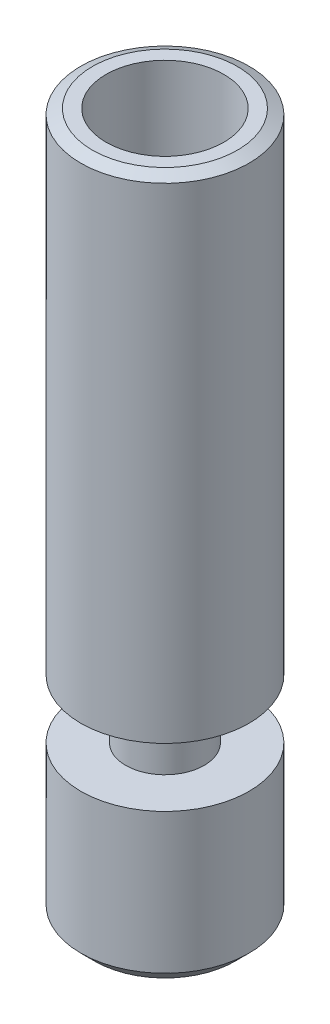
ISO-10303-21;
HEADER;
FILE_DESCRIPTION(('STEP AP214'),'2;1');
FILE_NAME('part.step','',(''),(''),'','','');
FILE_SCHEMA(('AUTOMOTIVE_DESIGN { 1 0 10303 214 1 1 1 1 }'));
ENDSEC;
DATA;
#1=APPLICATION_CONTEXT('core data for automotive mechanical design processes');
#2=APPLICATION_PROTOCOL_DEFINITION('international standard','automotive_design',2000,#1);
#3=PRODUCT_CONTEXT('',#1,'mechanical');
#4=PRODUCT('Part','Part','',(#3));
#5=PRODUCT_RELATED_PRODUCT_CATEGORY('part','',(#4));
#6=PRODUCT_DEFINITION_FORMATION('','',#4);
#7=PRODUCT_DEFINITION_CONTEXT('part definition',#1,'design');
#8=PRODUCT_DEFINITION('design','',#6,#7);
#9=PRODUCT_DEFINITION_SHAPE('','',#8);
#10=(LENGTH_UNIT() NAMED_UNIT(*) SI_UNIT(.MILLI.,.METRE.));
#11=(NAMED_UNIT(*) PLANE_ANGLE_UNIT() SI_UNIT($,.RADIAN.));
#12=(NAMED_UNIT(*) SI_UNIT($,.STERADIAN.) SOLID_ANGLE_UNIT());
#13=UNCERTAINTY_MEASURE_WITH_UNIT(LENGTH_MEASURE(1.E-05),#10,'distance_accuracy_value','');
#14=(GEOMETRIC_REPRESENTATION_CONTEXT(3) GLOBAL_UNCERTAINTY_ASSIGNED_CONTEXT((#13)) GLOBAL_UNIT_ASSIGNED_CONTEXT((#10,
#11,#12)) REPRESENTATION_CONTEXT('',''));
#15=CARTESIAN_POINT('',(0.,0.,0.));
#16=DIRECTION('',(0.,0.,1.));
#17=DIRECTION('',(1.,0.,0.));
#18=AXIS2_PLACEMENT_3D('',#15,#16,#17);
#19=CARTESIAN_POINT('',(0.,0.,0.));
#20=DIRECTION('',(0.,1.,0.));
#21=DIRECTION('',(0.,0.,1.));
#22=AXIS2_PLACEMENT_3D('',#19,#20,#21);
#23=CONICAL_SURFACE('',#22,3.,0.785398163397449);
#24=CARTESIAN_POINT('',(0.,-0.499999999972716,0.));
#25=DIRECTION('',(0.,1.,0.));
#26=DIRECTION('',(0.,0.,1.));
#27=AXIS2_PLACEMENT_3D('',#24,#25,#26);
#28=CIRCLE('',#27,2.50000000002728);
#29=CARTESIAN_POINT('',(0.,-0.499999999972716,2.50000000002728));
#30=VERTEX_POINT('',#29);
#31=EDGE_CURVE('E10',#30,#30,#28,.T.);
#32=ORIENTED_EDGE('',*,*,#31,.T.);
#33=EDGE_LOOP('',(#32));
#34=FACE_BOUND('',#33,.T.);
#35=CARTESIAN_POINT('',(0.,0.,0.));
#36=DIRECTION('',(0.,1.,0.));
#37=DIRECTION('',(0.,0.,1.));
#38=AXIS2_PLACEMENT_3D('',#35,#36,#37);
#39=CIRCLE('',#38,3.);
#40=CARTESIAN_POINT('',(0.,0.,3.));
#41=VERTEX_POINT('',#40);
#42=EDGE_CURVE('E71',#41,#41,#39,.T.);
#43=ORIENTED_EDGE('',*,*,#42,.F.);
#44=EDGE_LOOP('',(#43));
#45=FACE_BOUND('',#44,.T.);
#46=ADVANCED_FACE('F31',(#34,#45),#23,.T.);
#47=CARTESIAN_POINT('',(2.50000000002728,-0.499999999972716,0.));
#48=DIRECTION('',(0.,-1.,0.));
#49=DIRECTION('',(0.,0.,-1.));
#50=AXIS2_PLACEMENT_3D('',#47,#48,#49);
#51=PLANE('',#50);
#52=CARTESIAN_POINT('',(0.,-0.499999999972716,0.));
#53=DIRECTION('',(0.,1.,0.));
#54=DIRECTION('',(0.,0.,1.));
#55=AXIS2_PLACEMENT_3D('',#52,#53,#54);
#56=CIRCLE('',#55,0.999999999987541);
#57=CARTESIAN_POINT('',(0.,-0.499999999972716,0.999999999987541));
#58=VERTEX_POINT('',#57);
#59=EDGE_CURVE('E37',#58,#58,#56,.T.);
#60=ORIENTED_EDGE('',*,*,#59,.T.);
#61=EDGE_LOOP('',(#60));
#62=FACE_BOUND('',#61,.T.);
#63=ORIENTED_EDGE('',*,*,#31,.F.);
#64=EDGE_LOOP('',(#63));
#65=FACE_BOUND('',#64,.T.);
#66=ADVANCED_FACE('F79',(#62,#65),#51,.T.);
#67=CARTESIAN_POINT('',(0.,-0.499999999972716,0.));
#68=DIRECTION('',(0.,1.,0.));
#69=DIRECTION('',(0.,0.,1.));
#70=AXIS2_PLACEMENT_3D('',#67,#68,#69);
#71=CYLINDRICAL_SURFACE('',#70,0.999999999987541);
#72=CARTESIAN_POINT('',(0.,15.2999999999472,0.));
#73=DIRECTION('',(0.,1.,0.));
#74=DIRECTION('',(0.,0.,1.));
#75=AXIS2_PLACEMENT_3D('',#72,#73,#74);
#76=CIRCLE('',#75,0.999999999987541);
#77=CARTESIAN_POINT('',(0.,15.2999999999472,0.999999999987541));
#78=VERTEX_POINT('',#77);
#79=EDGE_CURVE('E41',#78,#78,#76,.T.);
#80=ORIENTED_EDGE('',*,*,#79,.T.);
#81=EDGE_LOOP('',(#80));
#82=FACE_BOUND('',#81,.T.);
#83=ORIENTED_EDGE('',*,*,#59,.F.);
#84=EDGE_LOOP('',(#83));
#85=FACE_BOUND('',#84,.T.);
#86=ADVANCED_FACE('F83',(#82,#85),#71,.F.);
#87=CARTESIAN_POINT('',(0.,15.2999999999472,0.));
#88=DIRECTION('',(0.,1.,0.));
#89=DIRECTION('',(0.,0.,1.));
#90=AXIS2_PLACEMENT_3D('',#87,#88,#89);
#91=CONICAL_SURFACE('',#90,0.999999999987541,0.785398163397449);
#92=CARTESIAN_POINT('',(0.,16.3999999999809,0.));
#93=DIRECTION('',(0.,1.,0.));
#94=DIRECTION('',(0.,0.,1.));
#95=AXIS2_PLACEMENT_3D('',#92,#93,#94);
#96=CIRCLE('',#95,2.10000000002133);
#97=CARTESIAN_POINT('',(0.,16.3999999999809,2.10000000002133));
#98=VERTEX_POINT('',#97);
#99=EDGE_CURVE('E45',#98,#98,#96,.T.);
#100=ORIENTED_EDGE('',*,*,#99,.T.);
#101=EDGE_LOOP('',(#100));
#102=FACE_BOUND('',#101,.T.);
#103=ORIENTED_EDGE('',*,*,#79,.F.);
#104=EDGE_LOOP('',(#103));
#105=FACE_BOUND('',#104,.T.);
#106=ADVANCED_FACE('F87',(#102,#105),#91,.F.);
#107=CARTESIAN_POINT('',(0.,-0.499999999972716,0.));
#108=DIRECTION('',(0.,1.,0.));
#109=DIRECTION('',(0.,0.,1.));
#110=AXIS2_PLACEMENT_3D('',#107,#108,#109);
#111=CYLINDRICAL_SURFACE('',#110,2.10000000002133);
#112=CARTESIAN_POINT('',(0.,24.5963264163051,0.));
#113=DIRECTION('',(0.,1.,0.));
#114=DIRECTION('',(0.,0.,1.));
#115=AXIS2_PLACEMENT_3D('',#112,#113,#114);
#116=CIRCLE('',#115,2.10000000002133);
#117=CARTESIAN_POINT('',(0.,24.5963264163051,2.10000000002133));
#118=VERTEX_POINT('',#117);
#119=EDGE_CURVE('E50',#118,#118,#116,.T.);
#120=ORIENTED_EDGE('',*,*,#119,.T.);
#121=EDGE_LOOP('',(#120));
#122=FACE_BOUND('',#121,.T.);
#123=ORIENTED_EDGE('',*,*,#99,.F.);
#124=EDGE_LOOP('',(#123));
#125=FACE_BOUND('',#124,.T.);
#126=ADVANCED_FACE('F94',(#122,#125),#111,.F.);
#127=CARTESIAN_POINT('',(2.10000000002133,24.5963264163051,0.));
#128=DIRECTION('',(0.,1.,0.));
#129=DIRECTION('',(0.,0.,1.));
#130=AXIS2_PLACEMENT_3D('',#127,#128,#129);
#131=PLANE('',#130);
#132=CARTESIAN_POINT('',(0.,24.5963264163051,0.));
#133=DIRECTION('',(0.,1.,0.));
#134=DIRECTION('',(0.,0.,1.));
#135=AXIS2_PLACEMENT_3D('',#132,#133,#134);
#136=CIRCLE('',#135,2.58676036504249);
#137=CARTESIAN_POINT('',(0.,24.5963264163051,2.58676036504249));
#138=VERTEX_POINT('',#137);
#139=EDGE_CURVE('E53',#138,#138,#136,.T.);
#140=ORIENTED_EDGE('',*,*,#139,.T.);
#141=EDGE_LOOP('',(#140));
#142=FACE_BOUND('',#141,.T.);
#143=ORIENTED_EDGE('',*,*,#119,.F.);
#144=EDGE_LOOP('',(#143));
#145=FACE_BOUND('',#144,.T.);
#146=ADVANCED_FACE('F98',(#142,#145),#131,.T.);
#147=CARTESIAN_POINT('',(0.,24.5963264163051,0.));
#148=DIRECTION('',(0.,-1.,0.));
#149=DIRECTION('',(0.,0.,-1.));
#150=AXIS2_PLACEMENT_3D('',#147,#148,#149);
#151=CONICAL_SURFACE('',#150,2.58676036504249,1.12727377498547);
#152=CARTESIAN_POINT('',(0.,24.4,0.));
#153=DIRECTION('',(0.,1.,0.));
#154=DIRECTION('',(0.,0.,1.));
#155=AXIS2_PLACEMENT_3D('',#152,#153,#154);
#156=CIRCLE('',#155,3.);
#157=CARTESIAN_POINT('',(0.,24.4,3.));
#158=VERTEX_POINT('',#157);
#159=EDGE_CURVE('E56',#158,#158,#156,.T.);
#160=ORIENTED_EDGE('',*,*,#159,.T.);
#161=EDGE_LOOP('',(#160));
#162=FACE_BOUND('',#161,.T.);
#163=ORIENTED_EDGE('',*,*,#139,.F.);
#164=EDGE_LOOP('',(#163));
#165=FACE_BOUND('',#164,.T.);
#166=ADVANCED_FACE('F102',(#162,#165),#151,.T.);
#167=CARTESIAN_POINT('',(0.,-0.499999999972716,0.));
#168=DIRECTION('',(0.,1.,0.));
#169=DIRECTION('',(0.,0.,1.));
#170=AXIS2_PLACEMENT_3D('',#167,#168,#169);
#171=CYLINDRICAL_SURFACE('',#170,3.);
#172=CARTESIAN_POINT('',(0.,7.1,0.));
#173=DIRECTION('',(0.,1.,0.));
#174=DIRECTION('',(0.,0.,1.));
#175=AXIS2_PLACEMENT_3D('',#172,#173,#174);
#176=CIRCLE('',#175,3.);
#177=CARTESIAN_POINT('',(0.,7.1,3.));
#178=VERTEX_POINT('',#177);
#179=EDGE_CURVE('E59',#178,#178,#176,.T.);
#180=ORIENTED_EDGE('',*,*,#179,.T.);
#181=EDGE_LOOP('',(#180));
#182=FACE_BOUND('',#181,.T.);
#183=ORIENTED_EDGE('',*,*,#159,.F.);
#184=EDGE_LOOP('',(#183));
#185=FACE_BOUND('',#184,.T.);
#186=ADVANCED_FACE('F106',(#182,#185),#171,.T.);
#187=CARTESIAN_POINT('',(3.,7.1,0.));
#188=DIRECTION('',(0.,-1.,0.));
#189=DIRECTION('',(0.,0.,-1.));
#190=AXIS2_PLACEMENT_3D('',#187,#188,#189);
#191=PLANE('',#190);
#192=CARTESIAN_POINT('',(0.,7.1,0.));
#193=DIRECTION('',(0.,1.,0.));
#194=DIRECTION('',(0.,0.,1.));
#195=AXIS2_PLACEMENT_3D('',#192,#193,#194);
#196=CIRCLE('',#195,1.4);
#197=CARTESIAN_POINT('',(0.,7.1,1.4));
#198=VERTEX_POINT('',#197);
#199=EDGE_CURVE('E62',#198,#198,#196,.T.);
#200=ORIENTED_EDGE('',*,*,#199,.T.);
#201=EDGE_LOOP('',(#200));
#202=FACE_BOUND('',#201,.T.);
#203=ORIENTED_EDGE('',*,*,#179,.F.);
#204=EDGE_LOOP('',(#203));
#205=FACE_BOUND('',#204,.T.);
#206=ADVANCED_FACE('F110',(#202,#205),#191,.T.);
#207=CARTESIAN_POINT('',(0.,-0.499999999972716,0.));
#208=DIRECTION('',(0.,1.,0.));
#209=DIRECTION('',(0.,0.,1.));
#210=AXIS2_PLACEMENT_3D('',#207,#208,#209);
#211=CYLINDRICAL_SURFACE('',#210,1.4);
#212=CARTESIAN_POINT('',(0.,5.,0.));
#213=DIRECTION('',(0.,1.,0.));
#214=DIRECTION('',(0.,0.,1.));
#215=AXIS2_PLACEMENT_3D('',#212,#213,#214);
#216=CIRCLE('',#215,1.4);
#217=CARTESIAN_POINT('',(0.,5.,1.4));
#218=VERTEX_POINT('',#217);
#219=EDGE_CURVE('E65',#218,#218,#216,.T.);
#220=ORIENTED_EDGE('',*,*,#219,.T.);
#221=EDGE_LOOP('',(#220));
#222=FACE_BOUND('',#221,.T.);
#223=ORIENTED_EDGE('',*,*,#199,.F.);
#224=EDGE_LOOP('',(#223));
#225=FACE_BOUND('',#224,.T.);
#226=ADVANCED_FACE('F114',(#222,#225),#211,.T.);
#227=CARTESIAN_POINT('',(1.4,5.,0.));
#228=DIRECTION('',(0.,1.,0.));
#229=DIRECTION('',(0.,0.,1.));
#230=AXIS2_PLACEMENT_3D('',#227,#228,#229);
#231=PLANE('',#230);
#232=CARTESIAN_POINT('',(0.,5.,0.));
#233=DIRECTION('',(0.,1.,0.));
#234=DIRECTION('',(0.,0.,1.));
#235=AXIS2_PLACEMENT_3D('',#232,#233,#234);
#236=CIRCLE('',#235,3.);
#237=CARTESIAN_POINT('',(0.,5.,3.));
#238=VERTEX_POINT('',#237);
#239=EDGE_CURVE('E68',#238,#238,#236,.T.);
#240=ORIENTED_EDGE('',*,*,#239,.T.);
#241=EDGE_LOOP('',(#240));
#242=FACE_BOUND('',#241,.T.);
#243=ORIENTED_EDGE('',*,*,#219,.F.);
#244=EDGE_LOOP('',(#243));
#245=FACE_BOUND('',#244,.T.);
#246=ADVANCED_FACE('F118',(#242,#245),#231,.T.);
#247=CARTESIAN_POINT('',(0.,-0.499999999972716,0.));
#248=DIRECTION('',(0.,1.,0.));
#249=DIRECTION('',(0.,0.,1.));
#250=AXIS2_PLACEMENT_3D('',#247,#248,#249);
#251=CYLINDRICAL_SURFACE('',#250,3.);
#252=ORIENTED_EDGE('',*,*,#42,.T.);
#253=EDGE_LOOP('',(#252));
#254=FACE_BOUND('',#253,.T.);
#255=ORIENTED_EDGE('',*,*,#239,.F.);
#256=EDGE_LOOP('',(#255));
#257=FACE_BOUND('',#256,.T.);
#258=ADVANCED_FACE('F75',(#254,#257),#251,.T.);
#259=CLOSED_SHELL('',(#46,#66,#86,#106,#126,#146,#166,#186,#206,#226,#246,#258));
#260=MANIFOLD_SOLID_BREP('B2',#259);
#261=ADVANCED_BREP_SHAPE_REPRESENTATION('',(#18,#260),#14);
#262=SHAPE_DEFINITION_REPRESENTATION(#9,#261);
ENDSEC;
END-ISO-10303-21;
